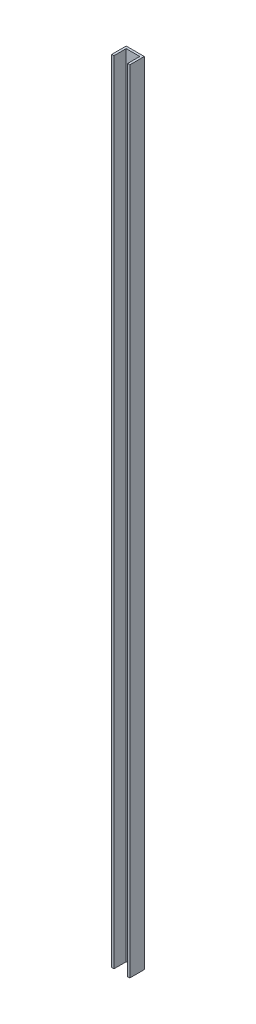
ISO-10303-21;
HEADER;
FILE_DESCRIPTION(('STEP AP214'),'2;1');
FILE_NAME('part.step','',(''),(''),'','','');
FILE_SCHEMA(('AUTOMOTIVE_DESIGN { 1 0 10303 214 1 1 1 1 }'));
ENDSEC;
DATA;
#1=APPLICATION_CONTEXT('core data for automotive mechanical design processes');
#2=APPLICATION_PROTOCOL_DEFINITION('international standard','automotive_design',2000,#1);
#3=PRODUCT_CONTEXT('',#1,'mechanical');
#4=PRODUCT('Part','Part','',(#3));
#5=PRODUCT_RELATED_PRODUCT_CATEGORY('part','',(#4));
#6=PRODUCT_DEFINITION_FORMATION('','',#4);
#7=PRODUCT_DEFINITION_CONTEXT('part definition',#1,'design');
#8=PRODUCT_DEFINITION('design','',#6,#7);
#9=PRODUCT_DEFINITION_SHAPE('','',#8);
#10=(LENGTH_UNIT() NAMED_UNIT(*) SI_UNIT(.MILLI.,.METRE.));
#11=(NAMED_UNIT(*) PLANE_ANGLE_UNIT() SI_UNIT($,.RADIAN.));
#12=(NAMED_UNIT(*) SI_UNIT($,.STERADIAN.) SOLID_ANGLE_UNIT());
#13=UNCERTAINTY_MEASURE_WITH_UNIT(LENGTH_MEASURE(1.E-05),#10,'distance_accuracy_value','');
#14=(GEOMETRIC_REPRESENTATION_CONTEXT(3) GLOBAL_UNCERTAINTY_ASSIGNED_CONTEXT((#13)) GLOBAL_UNIT_ASSIGNED_CONTEXT((#10,
#11,#12)) REPRESENTATION_CONTEXT('',''));
#15=CARTESIAN_POINT('',(0.,0.,0.));
#16=DIRECTION('',(0.,0.,1.));
#17=DIRECTION('',(1.,0.,0.));
#18=AXIS2_PLACEMENT_3D('',#15,#16,#17);
#19=CARTESIAN_POINT('',(3.75,436.,4.));
#20=DIRECTION('',(0.,0.,-1.));
#21=DIRECTION('',(-1.,0.,0.));
#22=AXIS2_PLACEMENT_3D('',#19,#20,#21);
#23=PLANE('',#22);
#24=DIRECTION('',(1.,0.,0.));
#25=VECTOR('',#24,1.);
#26=CARTESIAN_POINT('',(3.75,0.,4.));
#27=LINE('',#26,#25);
#28=CARTESIAN_POINT('',(3.75,0.,4.));
#29=VERTEX_POINT('',#28);
#30=CARTESIAN_POINT('',(5.,0.,4.));
#31=VERTEX_POINT('',#30);
#32=EDGE_CURVE('E129',#29,#31,#27,.T.);
#33=ORIENTED_EDGE('',*,*,#32,.T.);
#34=DIRECTION('',(0.,-1.,0.));
#35=VECTOR('',#34,1.);
#36=CARTESIAN_POINT('',(5.,436.,4.));
#37=LINE('',#36,#35);
#38=CARTESIAN_POINT('',(5.,436.,4.));
#39=VERTEX_POINT('',#38);
#40=EDGE_CURVE('E11',#39,#31,#37,.T.);
#41=ORIENTED_EDGE('',*,*,#40,.F.);
#42=DIRECTION('',(1.,0.,0.));
#43=VECTOR('',#42,1.);
#44=CARTESIAN_POINT('',(3.75,436.,4.));
#45=LINE('',#44,#43);
#46=CARTESIAN_POINT('',(3.75,436.,4.));
#47=VERTEX_POINT('',#46);
#48=EDGE_CURVE('E143',#47,#39,#45,.T.);
#49=ORIENTED_EDGE('',*,*,#48,.F.);
#50=DIRECTION('',(0.,-1.,0.));
#51=VECTOR('',#50,1.);
#52=CARTESIAN_POINT('',(3.75,436.,4.));
#53=LINE('',#52,#51);
#54=EDGE_CURVE('E125',#47,#29,#53,.T.);
#55=ORIENTED_EDGE('',*,*,#54,.T.);
#56=EDGE_LOOP('',(#33,#41,#49,#55));
#57=FACE_BOUND('',#56,.T.);
#58=ADVANCED_FACE('F33',(#57),#23,.F.);
#59=CARTESIAN_POINT('',(5.,436.,-4.));
#60=DIRECTION('',(-1.,0.,0.));
#61=DIRECTION('',(0.,0.,1.));
#62=AXIS2_PLACEMENT_3D('',#59,#60,#61);
#63=PLANE('',#62);
#64=DIRECTION('',(0.,0.,-1.));
#65=VECTOR('',#64,1.);
#66=CARTESIAN_POINT('',(5.,0.,-4.));
#67=LINE('',#66,#65);
#68=CARTESIAN_POINT('',(5.,0.,-4.));
#69=VERTEX_POINT('',#68);
#70=EDGE_CURVE('E132',#31,#69,#67,.T.);
#71=ORIENTED_EDGE('',*,*,#70,.T.);
#72=DIRECTION('',(0.,-1.,0.));
#73=VECTOR('',#72,1.);
#74=CARTESIAN_POINT('',(5.,436.,-4.));
#75=LINE('',#74,#73);
#76=CARTESIAN_POINT('',(5.,436.,-4.));
#77=VERTEX_POINT('',#76);
#78=EDGE_CURVE('E41',#77,#69,#75,.T.);
#79=ORIENTED_EDGE('',*,*,#78,.F.);
#80=DIRECTION('',(0.,0.,-1.));
#81=VECTOR('',#80,1.);
#82=CARTESIAN_POINT('',(5.,436.,-4.));
#83=LINE('',#82,#81);
#84=EDGE_CURVE('E92',#39,#77,#83,.T.);
#85=ORIENTED_EDGE('',*,*,#84,.F.);
#86=ORIENTED_EDGE('',*,*,#40,.T.);
#87=EDGE_LOOP('',(#71,#79,#85,#86));
#88=FACE_BOUND('',#87,.T.);
#89=ADVANCED_FACE('F178',(#88),#63,.F.);
#90=CARTESIAN_POINT('',(-5.,436.,-4.));
#91=DIRECTION('',(0.,0.,1.));
#92=DIRECTION('',(1.,0.,0.));
#93=AXIS2_PLACEMENT_3D('',#90,#91,#92);
#94=PLANE('',#93);
#95=DIRECTION('',(-1.,0.,0.));
#96=VECTOR('',#95,1.);
#97=CARTESIAN_POINT('',(-5.,0.,-4.));
#98=LINE('',#97,#96);
#99=CARTESIAN_POINT('',(-5.,0.,-4.));
#100=VERTEX_POINT('',#99);
#101=EDGE_CURVE('E134',#69,#100,#98,.T.);
#102=ORIENTED_EDGE('',*,*,#101,.T.);
#103=DIRECTION('',(0.,-1.,0.));
#104=VECTOR('',#103,1.);
#105=CARTESIAN_POINT('',(-5.,436.,-4.));
#106=LINE('',#105,#104);
#107=CARTESIAN_POINT('',(-5.,436.,-4.));
#108=VERTEX_POINT('',#107);
#109=EDGE_CURVE('E150',#108,#100,#106,.T.);
#110=ORIENTED_EDGE('',*,*,#109,.F.);
#111=DIRECTION('',(-1.,0.,0.));
#112=VECTOR('',#111,1.);
#113=CARTESIAN_POINT('',(-5.,436.,-4.));
#114=LINE('',#113,#112);
#115=EDGE_CURVE('E158',#77,#108,#114,.T.);
#116=ORIENTED_EDGE('',*,*,#115,.F.);
#117=ORIENTED_EDGE('',*,*,#78,.T.);
#118=EDGE_LOOP('',(#102,#110,#116,#117));
#119=FACE_BOUND('',#118,.T.);
#120=ADVANCED_FACE('F156',(#119),#94,.F.);
#121=CARTESIAN_POINT('',(-5.,436.,-4.));
#122=DIRECTION('',(1.,0.,0.));
#123=DIRECTION('',(0.,0.,-1.));
#124=AXIS2_PLACEMENT_3D('',#121,#122,#123);
#125=PLANE('',#124);
#126=DIRECTION('',(0.,0.,1.));
#127=VECTOR('',#126,1.);
#128=CARTESIAN_POINT('',(-5.,0.,-4.));
#129=LINE('',#128,#127);
#130=CARTESIAN_POINT('',(-5.,0.,4.));
#131=VERTEX_POINT('',#130);
#132=EDGE_CURVE('E136',#100,#131,#129,.T.);
#133=ORIENTED_EDGE('',*,*,#132,.T.);
#134=DIRECTION('',(0.,-1.,0.));
#135=VECTOR('',#134,1.);
#136=CARTESIAN_POINT('',(-5.,436.,4.));
#137=LINE('',#136,#135);
#138=CARTESIAN_POINT('',(-5.,436.,4.));
#139=VERTEX_POINT('',#138);
#140=EDGE_CURVE('E147',#139,#131,#137,.T.);
#141=ORIENTED_EDGE('',*,*,#140,.F.);
#142=DIRECTION('',(0.,0.,1.));
#143=VECTOR('',#142,1.);
#144=CARTESIAN_POINT('',(-5.,436.,-4.));
#145=LINE('',#144,#143);
#146=EDGE_CURVE('E170',#108,#139,#145,.T.);
#147=ORIENTED_EDGE('',*,*,#146,.F.);
#148=ORIENTED_EDGE('',*,*,#109,.T.);
#149=EDGE_LOOP('',(#133,#141,#147,#148));
#150=FACE_BOUND('',#149,.T.);
#151=ADVANCED_FACE('F166',(#150),#125,.F.);
#152=CARTESIAN_POINT('',(-5.,436.,4.));
#153=DIRECTION('',(0.,0.,-1.));
#154=DIRECTION('',(-1.,0.,0.));
#155=AXIS2_PLACEMENT_3D('',#152,#153,#154);
#156=PLANE('',#155);
#157=DIRECTION('',(1.,0.,0.));
#158=VECTOR('',#157,1.);
#159=CARTESIAN_POINT('',(-5.,0.,4.));
#160=LINE('',#159,#158);
#161=CARTESIAN_POINT('',(-3.75,0.,4.));
#162=VERTEX_POINT('',#161);
#163=EDGE_CURVE('E138',#131,#162,#160,.T.);
#164=ORIENTED_EDGE('',*,*,#163,.T.);
#165=DIRECTION('',(0.,-1.,0.));
#166=VECTOR('',#165,1.);
#167=CARTESIAN_POINT('',(-3.75,436.,4.));
#168=LINE('',#167,#166);
#169=CARTESIAN_POINT('',(-3.75,436.,4.));
#170=VERTEX_POINT('',#169);
#171=EDGE_CURVE('E120',#170,#162,#168,.T.);
#172=ORIENTED_EDGE('',*,*,#171,.F.);
#173=DIRECTION('',(1.,0.,0.));
#174=VECTOR('',#173,1.);
#175=CARTESIAN_POINT('',(-5.,436.,4.));
#176=LINE('',#175,#174);
#177=EDGE_CURVE('E111',#139,#170,#176,.T.);
#178=ORIENTED_EDGE('',*,*,#177,.F.);
#179=ORIENTED_EDGE('',*,*,#140,.T.);
#180=EDGE_LOOP('',(#164,#172,#178,#179));
#181=FACE_BOUND('',#180,.T.);
#182=ADVANCED_FACE('F169',(#181),#156,.F.);
#183=CARTESIAN_POINT('',(-3.75,436.,-2.75));
#184=DIRECTION('',(-1.,0.,0.));
#185=DIRECTION('',(0.,0.,1.));
#186=AXIS2_PLACEMENT_3D('',#183,#184,#185);
#187=PLANE('',#186);
#188=DIRECTION('',(0.,0.,-1.));
#189=VECTOR('',#188,1.);
#190=CARTESIAN_POINT('',(-3.75,0.,-2.75));
#191=LINE('',#190,#189);
#192=CARTESIAN_POINT('',(-3.75,0.,-2.75));
#193=VERTEX_POINT('',#192);
#194=EDGE_CURVE('E119',#162,#193,#191,.T.);
#195=ORIENTED_EDGE('',*,*,#194,.T.);
#196=DIRECTION('',(0.,-1.,0.));
#197=VECTOR('',#196,1.);
#198=CARTESIAN_POINT('',(-3.75,436.,-2.75));
#199=LINE('',#198,#197);
#200=CARTESIAN_POINT('',(-3.75,436.,-2.75));
#201=VERTEX_POINT('',#200);
#202=EDGE_CURVE('E116',#201,#193,#199,.T.);
#203=ORIENTED_EDGE('',*,*,#202,.F.);
#204=DIRECTION('',(0.,0.,-1.));
#205=VECTOR('',#204,1.);
#206=CARTESIAN_POINT('',(-3.75,436.,-2.75));
#207=LINE('',#206,#205);
#208=EDGE_CURVE('E105',#170,#201,#207,.T.);
#209=ORIENTED_EDGE('',*,*,#208,.F.);
#210=ORIENTED_EDGE('',*,*,#171,.T.);
#211=EDGE_LOOP('',(#195,#203,#209,#210));
#212=FACE_BOUND('',#211,.T.);
#213=ADVANCED_FACE('F117',(#212),#187,.F.);
#214=CARTESIAN_POINT('',(-3.75,436.,-2.75));
#215=DIRECTION('',(0.,0.,-1.));
#216=DIRECTION('',(-1.,0.,0.));
#217=AXIS2_PLACEMENT_3D('',#214,#215,#216);
#218=PLANE('',#217);
#219=DIRECTION('',(1.,0.,0.));
#220=VECTOR('',#219,1.);
#221=CARTESIAN_POINT('',(-3.75,0.,-2.75));
#222=LINE('',#221,#220);
#223=CARTESIAN_POINT('',(3.75,0.,-2.75));
#224=VERTEX_POINT('',#223);
#225=EDGE_CURVE('E78',#193,#224,#222,.T.);
#226=ORIENTED_EDGE('',*,*,#225,.T.);
#227=DIRECTION('',(0.,-1.,0.));
#228=VECTOR('',#227,1.);
#229=CARTESIAN_POINT('',(3.75,436.,-2.75));
#230=LINE('',#229,#228);
#231=CARTESIAN_POINT('',(3.75,436.,-2.75));
#232=VERTEX_POINT('',#231);
#233=EDGE_CURVE('E121',#232,#224,#230,.T.);
#234=ORIENTED_EDGE('',*,*,#233,.F.);
#235=DIRECTION('',(1.,0.,0.));
#236=VECTOR('',#235,1.);
#237=CARTESIAN_POINT('',(-3.75,436.,-2.75));
#238=LINE('',#237,#236);
#239=EDGE_CURVE('E109',#201,#232,#238,.T.);
#240=ORIENTED_EDGE('',*,*,#239,.F.);
#241=ORIENTED_EDGE('',*,*,#202,.T.);
#242=EDGE_LOOP('',(#226,#234,#240,#241));
#243=FACE_BOUND('',#242,.T.);
#244=ADVANCED_FACE('F123',(#243),#218,.F.);
#245=CARTESIAN_POINT('',(3.75,436.,-2.75));
#246=DIRECTION('',(1.,0.,0.));
#247=DIRECTION('',(0.,0.,-1.));
#248=AXIS2_PLACEMENT_3D('',#245,#246,#247);
#249=PLANE('',#248);
#250=DIRECTION('',(0.,0.,1.));
#251=VECTOR('',#250,1.);
#252=CARTESIAN_POINT('',(3.75,0.,-2.75));
#253=LINE('',#252,#251);
#254=EDGE_CURVE('E84',#224,#29,#253,.T.);
#255=ORIENTED_EDGE('',*,*,#254,.T.);
#256=ORIENTED_EDGE('',*,*,#54,.F.);
#257=DIRECTION('',(0.,0.,1.));
#258=VECTOR('',#257,1.);
#259=CARTESIAN_POINT('',(3.75,436.,-2.75));
#260=LINE('',#259,#258);
#261=EDGE_CURVE('E49',#232,#47,#260,.T.);
#262=ORIENTED_EDGE('',*,*,#261,.F.);
#263=ORIENTED_EDGE('',*,*,#233,.T.);
#264=EDGE_LOOP('',(#255,#256,#262,#263));
#265=FACE_BOUND('',#264,.T.);
#266=ADVANCED_FACE('F194',(#265),#249,.F.);
#267=CARTESIAN_POINT('',(0.,436.,0.));
#268=DIRECTION('',(0.,-1.,0.));
#269=DIRECTION('',(0.,0.,-1.));
#270=AXIS2_PLACEMENT_3D('',#267,#268,#269);
#271=PLANE('',#270);
#272=ORIENTED_EDGE('',*,*,#48,.T.);
#273=ORIENTED_EDGE('',*,*,#84,.T.);
#274=ORIENTED_EDGE('',*,*,#115,.T.);
#275=ORIENTED_EDGE('',*,*,#146,.T.);
#276=ORIENTED_EDGE('',*,*,#177,.T.);
#277=ORIENTED_EDGE('',*,*,#208,.T.);
#278=ORIENTED_EDGE('',*,*,#239,.T.);
#279=ORIENTED_EDGE('',*,*,#261,.T.);
#280=EDGE_LOOP('',(#272,#273,#274,#275,#276,#277,#278,#279));
#281=FACE_BOUND('',#280,.T.);
#282=ADVANCED_FACE('F107',(#281),#271,.F.);
#283=CARTESIAN_POINT('',(0.,0.,0.));
#284=DIRECTION('',(0.,-1.,0.));
#285=DIRECTION('',(0.,0.,-1.));
#286=AXIS2_PLACEMENT_3D('',#283,#284,#285);
#287=PLANE('',#286);
#288=ORIENTED_EDGE('',*,*,#32,.F.);
#289=ORIENTED_EDGE('',*,*,#254,.F.);
#290=ORIENTED_EDGE('',*,*,#225,.F.);
#291=ORIENTED_EDGE('',*,*,#194,.F.);
#292=ORIENTED_EDGE('',*,*,#163,.F.);
#293=ORIENTED_EDGE('',*,*,#132,.F.);
#294=ORIENTED_EDGE('',*,*,#101,.F.);
#295=ORIENTED_EDGE('',*,*,#70,.F.);
#296=EDGE_LOOP('',(#288,#289,#290,#291,#292,#293,#294,#295));
#297=FACE_BOUND('',#296,.T.);
#298=ADVANCED_FACE('F162',(#297),#287,.T.);
#299=CLOSED_SHELL('',(#58,#89,#120,#151,#182,#213,#244,#266,#282,#298));
#300=MANIFOLD_SOLID_BREP('B2',#299);
#301=ADVANCED_BREP_SHAPE_REPRESENTATION('',(#18,#300),#14);
#302=SHAPE_DEFINITION_REPRESENTATION(#9,#301);
ENDSEC;
END-ISO-10303-21;
